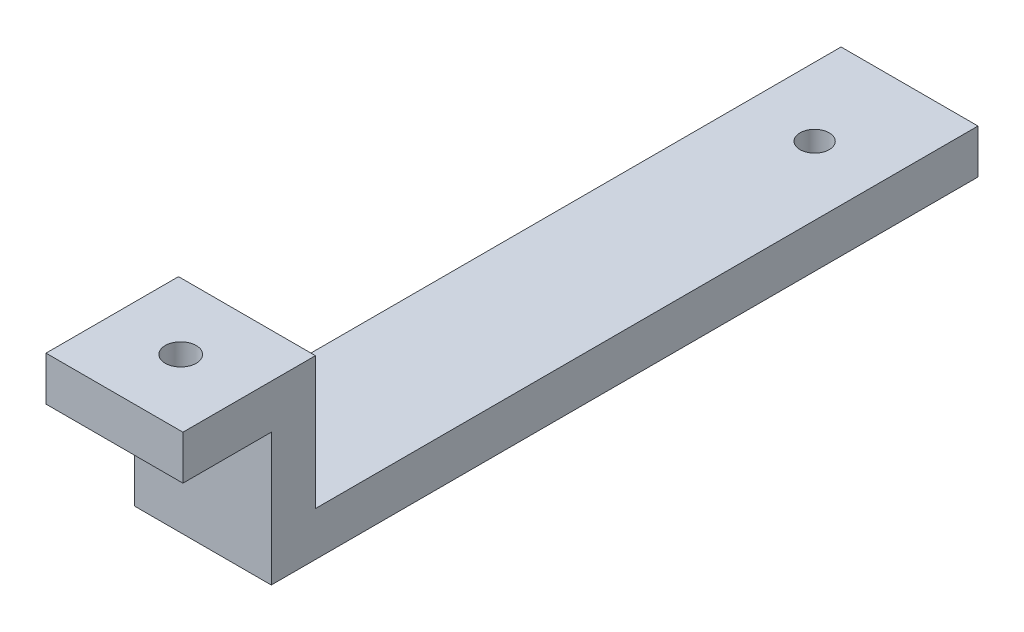
ISO-10303-21;
HEADER;
FILE_DESCRIPTION(('STEP AP214'),'2;1');
FILE_NAME('part.step','',(''),(''),'','','');
FILE_SCHEMA(('AUTOMOTIVE_DESIGN { 1 0 10303 214 1 1 1 1 }'));
ENDSEC;
DATA;
#1=APPLICATION_CONTEXT('core data for automotive mechanical design processes');
#2=APPLICATION_PROTOCOL_DEFINITION('international standard','automotive_design',2000,#1);
#3=PRODUCT_CONTEXT('',#1,'mechanical');
#4=PRODUCT('Part','Part','',(#3));
#5=PRODUCT_RELATED_PRODUCT_CATEGORY('part','',(#4));
#6=PRODUCT_DEFINITION_FORMATION('','',#4);
#7=PRODUCT_DEFINITION_CONTEXT('part definition',#1,'design');
#8=PRODUCT_DEFINITION('design','',#6,#7);
#9=PRODUCT_DEFINITION_SHAPE('','',#8);
#10=(LENGTH_UNIT() NAMED_UNIT(*) SI_UNIT(.MILLI.,.METRE.));
#11=(NAMED_UNIT(*) PLANE_ANGLE_UNIT() SI_UNIT($,.RADIAN.));
#12=(NAMED_UNIT(*) SI_UNIT($,.STERADIAN.) SOLID_ANGLE_UNIT());
#13=UNCERTAINTY_MEASURE_WITH_UNIT(LENGTH_MEASURE(1.E-05),#10,'distance_accuracy_value','');
#14=(GEOMETRIC_REPRESENTATION_CONTEXT(3) GLOBAL_UNCERTAINTY_ASSIGNED_CONTEXT((#13)) GLOBAL_UNIT_ASSIGNED_CONTEXT((#10,
#11,#12)) REPRESENTATION_CONTEXT('',''));
#15=CARTESIAN_POINT('',(0.,0.,0.));
#16=DIRECTION('',(0.,0.,1.));
#17=DIRECTION('',(1.,0.,0.));
#18=AXIS2_PLACEMENT_3D('',#15,#16,#17);
#19=CARTESIAN_POINT('',(31.,-39.972,-30.));
#20=DIRECTION('',(0.,1.,0.));
#21=DIRECTION('',(0.,0.,1.));
#22=AXIS2_PLACEMENT_3D('',#19,#20,#21);
#23=PLANE('',#22);
#24=CARTESIAN_POINT('',(15.494,-39.972,-158.524));
#25=DIRECTION('',(0.,1.,0.));
#26=DIRECTION('',(0.,0.,1.));
#27=AXIS2_PLACEMENT_3D('',#24,#25,#26);
#28=CIRCLE('',#27,3.30199999999998);
#29=CARTESIAN_POINT('',(15.494,-39.972,-155.222));
#30=VERTEX_POINT('',#29);
#31=EDGE_CURVE('E182',#30,#30,#28,.T.);
#32=ORIENTED_EDGE('',*,*,#31,.T.);
#33=EDGE_LOOP('',(#32));
#34=FACE_BOUND('',#33,.T.);
#35=DIRECTION('',(0.,0.,-1.));
#36=VECTOR('',#35,1.);
#37=CARTESIAN_POINT('',(0.,-39.972,-30.));
#38=LINE('',#37,#36);
#39=CARTESIAN_POINT('',(0.,-39.972,-20.));
#40=VERTEX_POINT('',#39);
#41=CARTESIAN_POINT('',(0.,-39.972,-180.));
#42=VERTEX_POINT('',#41);
#43=EDGE_CURVE('E131',#40,#42,#38,.T.);
#44=ORIENTED_EDGE('',*,*,#43,.T.);
#45=DIRECTION('',(-1.,0.,0.));
#46=VECTOR('',#45,1.);
#47=CARTESIAN_POINT('',(31.,-39.972,-180.));
#48=LINE('',#47,#46);
#49=CARTESIAN_POINT('',(31.,-39.972,-180.));
#50=VERTEX_POINT('',#49);
#51=EDGE_CURVE('E11',#50,#42,#48,.T.);
#52=ORIENTED_EDGE('',*,*,#51,.F.);
#53=DIRECTION('',(0.,0.,-1.));
#54=VECTOR('',#53,1.);
#55=CARTESIAN_POINT('',(31.,-39.972,-30.));
#56=LINE('',#55,#54);
#57=CARTESIAN_POINT('',(31.,-39.972,-20.));
#58=VERTEX_POINT('',#57);
#59=EDGE_CURVE('E89',#58,#50,#56,.T.);
#60=ORIENTED_EDGE('',*,*,#59,.F.);
#61=DIRECTION('',(-1.,0.,0.));
#62=VECTOR('',#61,1.);
#63=CARTESIAN_POINT('',(31.,-39.972,-20.));
#64=LINE('',#63,#62);
#65=EDGE_CURVE('E130',#58,#40,#64,.T.);
#66=ORIENTED_EDGE('',*,*,#65,.T.);
#67=EDGE_LOOP('',(#44,#52,#60,#66));
#68=FACE_BOUND('',#67,.T.);
#69=ADVANCED_FACE('F34',(#34,#68),#23,.F.);
#70=CARTESIAN_POINT('',(31.,-29.972,-180.));
#71=DIRECTION('',(0.,0.,-1.));
#72=DIRECTION('',(-1.,0.,0.));
#73=AXIS2_PLACEMENT_3D('',#70,#71,#72);
#74=PLANE('',#73);
#75=DIRECTION('',(0.,-1.,0.));
#76=VECTOR('',#75,1.);
#77=CARTESIAN_POINT('',(0.,-29.972,-180.));
#78=LINE('',#77,#76);
#79=CARTESIAN_POINT('',(0.,-29.972,-180.));
#80=VERTEX_POINT('',#79);
#81=EDGE_CURVE('E134',#80,#42,#78,.T.);
#82=ORIENTED_EDGE('',*,*,#81,.F.);
#83=DIRECTION('',(-1.,0.,0.));
#84=VECTOR('',#83,1.);
#85=CARTESIAN_POINT('',(31.,-29.972,-180.));
#86=LINE('',#85,#84);
#87=CARTESIAN_POINT('',(31.,-29.972,-180.));
#88=VERTEX_POINT('',#87);
#89=EDGE_CURVE('E42',#88,#80,#86,.T.);
#90=ORIENTED_EDGE('',*,*,#89,.F.);
#91=DIRECTION('',(0.,-1.,0.));
#92=VECTOR('',#91,1.);
#93=CARTESIAN_POINT('',(31.,-29.972,-180.));
#94=LINE('',#93,#92);
#95=EDGE_CURVE('E174',#88,#50,#94,.T.);
#96=ORIENTED_EDGE('',*,*,#95,.T.);
#97=ORIENTED_EDGE('',*,*,#51,.T.);
#98=EDGE_LOOP('',(#82,#90,#96,#97));
#99=FACE_BOUND('',#98,.T.);
#100=ADVANCED_FACE('F165',(#99),#74,.T.);
#101=CARTESIAN_POINT('',(31.,-29.972,-30.));
#102=DIRECTION('',(0.,1.,0.));
#103=DIRECTION('',(0.,0.,1.));
#104=AXIS2_PLACEMENT_3D('',#101,#102,#103);
#105=PLANE('',#104);
#106=CARTESIAN_POINT('',(15.494,-29.972,-158.524));
#107=DIRECTION('',(0.,1.,0.));
#108=DIRECTION('',(0.,0.,1.));
#109=AXIS2_PLACEMENT_3D('',#106,#107,#108);
#110=CIRCLE('',#109,3.30199999999998);
#111=CARTESIAN_POINT('',(15.494,-29.972,-155.222));
#112=VERTEX_POINT('',#111);
#113=EDGE_CURVE('E187',#112,#112,#110,.T.);
#114=ORIENTED_EDGE('',*,*,#113,.F.);
#115=EDGE_LOOP('',(#114));
#116=FACE_BOUND('',#115,.T.);
#117=DIRECTION('',(0.,0.,-1.));
#118=VECTOR('',#117,1.);
#119=CARTESIAN_POINT('',(0.,-29.972,-30.));
#120=LINE('',#119,#118);
#121=CARTESIAN_POINT('',(0.,-29.972,-30.));
#122=VERTEX_POINT('',#121);
#123=EDGE_CURVE('E138',#122,#80,#120,.T.);
#124=ORIENTED_EDGE('',*,*,#123,.F.);
#125=DIRECTION('',(-1.,0.,0.));
#126=VECTOR('',#125,1.);
#127=CARTESIAN_POINT('',(31.,-29.972,-30.));
#128=LINE('',#127,#126);
#129=CARTESIAN_POINT('',(31.,-29.972,-30.));
#130=VERTEX_POINT('',#129);
#131=EDGE_CURVE('E155',#130,#122,#128,.T.);
#132=ORIENTED_EDGE('',*,*,#131,.F.);
#133=DIRECTION('',(0.,0.,-1.));
#134=VECTOR('',#133,1.);
#135=CARTESIAN_POINT('',(31.,-29.972,-30.));
#136=LINE('',#135,#134);
#137=EDGE_CURVE('E162',#130,#88,#136,.T.);
#138=ORIENTED_EDGE('',*,*,#137,.T.);
#139=ORIENTED_EDGE('',*,*,#89,.T.);
#140=EDGE_LOOP('',(#124,#132,#138,#139));
#141=FACE_BOUND('',#140,.T.);
#142=ADVANCED_FACE('F160',(#116,#141),#105,.T.);
#143=CARTESIAN_POINT('',(31.,0.,-30.));
#144=DIRECTION('',(0.,0.,-1.));
#145=DIRECTION('',(-1.,0.,0.));
#146=AXIS2_PLACEMENT_3D('',#143,#144,#145);
#147=PLANE('',#146);
#148=DIRECTION('',(0.,-1.,0.));
#149=VECTOR('',#148,1.);
#150=CARTESIAN_POINT('',(0.,0.,-30.));
#151=LINE('',#150,#149);
#152=CARTESIAN_POINT('',(0.,0.,-30.));
#153=VERTEX_POINT('',#152);
#154=EDGE_CURVE('E141',#153,#122,#151,.T.);
#155=ORIENTED_EDGE('',*,*,#154,.F.);
#156=DIRECTION('',(-1.,0.,0.));
#157=VECTOR('',#156,1.);
#158=CARTESIAN_POINT('',(31.,0.,-30.));
#159=LINE('',#158,#157);
#160=CARTESIAN_POINT('',(31.,0.,-30.));
#161=VERTEX_POINT('',#160);
#162=EDGE_CURVE('E153',#161,#153,#159,.T.);
#163=ORIENTED_EDGE('',*,*,#162,.F.);
#164=DIRECTION('',(0.,-1.,0.));
#165=VECTOR('',#164,1.);
#166=CARTESIAN_POINT('',(31.,0.,-30.));
#167=LINE('',#166,#165);
#168=EDGE_CURVE('E125',#161,#130,#167,.T.);
#169=ORIENTED_EDGE('',*,*,#168,.T.);
#170=ORIENTED_EDGE('',*,*,#131,.T.);
#171=EDGE_LOOP('',(#155,#163,#169,#170));
#172=FACE_BOUND('',#171,.T.);
#173=ADVANCED_FACE('F172',(#172),#147,.T.);
#174=CARTESIAN_POINT('',(31.,0.,0.));
#175=DIRECTION('',(0.,1.,0.));
#176=DIRECTION('',(0.,0.,1.));
#177=AXIS2_PLACEMENT_3D('',#174,#175,#176);
#178=PLANE('',#177);
#179=CARTESIAN_POINT('',(15.5,0.,-15.));
#180=DIRECTION('',(0.,1.,0.));
#181=DIRECTION('',(0.,0.,1.));
#182=AXIS2_PLACEMENT_3D('',#179,#180,#181);
#183=CIRCLE('',#182,3.5);
#184=CARTESIAN_POINT('',(15.5,0.,-11.5));
#185=VERTEX_POINT('',#184);
#186=EDGE_CURVE('E179',#185,#185,#183,.T.);
#187=ORIENTED_EDGE('',*,*,#186,.F.);
#188=EDGE_LOOP('',(#187));
#189=FACE_BOUND('',#188,.T.);
#190=DIRECTION('',(0.,0.,-1.));
#191=VECTOR('',#190,1.);
#192=CARTESIAN_POINT('',(0.,0.,0.));
#193=LINE('',#192,#191);
#194=CARTESIAN_POINT('',(0.,0.,0.));
#195=VERTEX_POINT('',#194);
#196=EDGE_CURVE('E144',#195,#153,#193,.T.);
#197=ORIENTED_EDGE('',*,*,#196,.F.);
#198=DIRECTION('',(-1.,0.,0.));
#199=VECTOR('',#198,1.);
#200=CARTESIAN_POINT('',(31.,0.,0.));
#201=LINE('',#200,#199);
#202=CARTESIAN_POINT('',(31.,0.,0.));
#203=VERTEX_POINT('',#202);
#204=EDGE_CURVE('E113',#203,#195,#201,.T.);
#205=ORIENTED_EDGE('',*,*,#204,.F.);
#206=DIRECTION('',(0.,0.,-1.));
#207=VECTOR('',#206,1.);
#208=CARTESIAN_POINT('',(31.,0.,0.));
#209=LINE('',#208,#207);
#210=EDGE_CURVE('E123',#203,#161,#209,.T.);
#211=ORIENTED_EDGE('',*,*,#210,.T.);
#212=ORIENTED_EDGE('',*,*,#162,.T.);
#213=EDGE_LOOP('',(#197,#205,#211,#212));
#214=FACE_BOUND('',#213,.T.);
#215=ADVANCED_FACE('F200',(#189,#214),#178,.T.);
#216=CARTESIAN_POINT('',(31.,-10.,0.));
#217=DIRECTION('',(0.,0.,1.));
#218=DIRECTION('',(1.,0.,0.));
#219=AXIS2_PLACEMENT_3D('',#216,#217,#218);
#220=PLANE('',#219);
#221=DIRECTION('',(0.,1.,0.));
#222=VECTOR('',#221,1.);
#223=CARTESIAN_POINT('',(0.,-10.,0.));
#224=LINE('',#223,#222);
#225=CARTESIAN_POINT('',(0.,-10.,0.));
#226=VERTEX_POINT('',#225);
#227=EDGE_CURVE('E112',#226,#195,#224,.T.);
#228=ORIENTED_EDGE('',*,*,#227,.F.);
#229=DIRECTION('',(-1.,0.,0.));
#230=VECTOR('',#229,1.);
#231=CARTESIAN_POINT('',(31.,-10.,0.));
#232=LINE('',#231,#230);
#233=CARTESIAN_POINT('',(31.,-10.,0.));
#234=VERTEX_POINT('',#233);
#235=EDGE_CURVE('E106',#234,#226,#232,.T.);
#236=ORIENTED_EDGE('',*,*,#235,.F.);
#237=DIRECTION('',(0.,1.,0.));
#238=VECTOR('',#237,1.);
#239=CARTESIAN_POINT('',(31.,-10.,0.));
#240=LINE('',#239,#238);
#241=EDGE_CURVE('E110',#234,#203,#240,.T.);
#242=ORIENTED_EDGE('',*,*,#241,.T.);
#243=ORIENTED_EDGE('',*,*,#204,.T.);
#244=EDGE_LOOP('',(#228,#236,#242,#243));
#245=FACE_BOUND('',#244,.T.);
#246=ADVANCED_FACE('F108',(#245),#220,.T.);
#247=CARTESIAN_POINT('',(31.,-10.,0.));
#248=DIRECTION('',(0.,1.,0.));
#249=DIRECTION('',(0.,0.,1.));
#250=AXIS2_PLACEMENT_3D('',#247,#248,#249);
#251=PLANE('',#250);
#252=CARTESIAN_POINT('',(15.5,-10.,-15.));
#253=DIRECTION('',(0.,1.,0.));
#254=DIRECTION('',(0.,0.,1.));
#255=AXIS2_PLACEMENT_3D('',#252,#253,#254);
#256=CIRCLE('',#255,3.5);
#257=CARTESIAN_POINT('',(15.5,-10.,-11.5));
#258=VERTEX_POINT('',#257);
#259=EDGE_CURVE('E135',#258,#258,#256,.T.);
#260=ORIENTED_EDGE('',*,*,#259,.T.);
#261=EDGE_LOOP('',(#260));
#262=FACE_BOUND('',#261,.T.);
#263=DIRECTION('',(0.,0.,-1.));
#264=VECTOR('',#263,1.);
#265=CARTESIAN_POINT('',(0.,-10.,0.));
#266=LINE('',#265,#264);
#267=CARTESIAN_POINT('',(0.,-10.,-20.));
#268=VERTEX_POINT('',#267);
#269=EDGE_CURVE('E77',#226,#268,#266,.T.);
#270=ORIENTED_EDGE('',*,*,#269,.T.);
#271=DIRECTION('',(-1.,0.,0.));
#272=VECTOR('',#271,1.);
#273=CARTESIAN_POINT('',(31.,-10.,-20.));
#274=LINE('',#273,#272);
#275=CARTESIAN_POINT('',(31.,-10.,-20.));
#276=VERTEX_POINT('',#275);
#277=EDGE_CURVE('E114',#276,#268,#274,.T.);
#278=ORIENTED_EDGE('',*,*,#277,.F.);
#279=DIRECTION('',(0.,0.,-1.));
#280=VECTOR('',#279,1.);
#281=CARTESIAN_POINT('',(31.,-10.,0.));
#282=LINE('',#281,#280);
#283=EDGE_CURVE('E116',#234,#276,#282,.T.);
#284=ORIENTED_EDGE('',*,*,#283,.F.);
#285=ORIENTED_EDGE('',*,*,#235,.T.);
#286=EDGE_LOOP('',(#270,#278,#284,#285));
#287=FACE_BOUND('',#286,.T.);
#288=ADVANCED_FACE('F117',(#262,#287),#251,.F.);
#289=CARTESIAN_POINT('',(31.,0.,-20.));
#290=DIRECTION('',(0.,0.,-1.));
#291=DIRECTION('',(-1.,0.,0.));
#292=AXIS2_PLACEMENT_3D('',#289,#290,#291);
#293=PLANE('',#292);
#294=DIRECTION('',(0.,1.,0.));
#295=VECTOR('',#294,1.);
#296=CARTESIAN_POINT('',(0.,0.,-20.));
#297=LINE('',#296,#295);
#298=EDGE_CURVE('E83',#268,#40,#297,.F.);
#299=ORIENTED_EDGE('',*,*,#298,.T.);
#300=ORIENTED_EDGE('',*,*,#65,.F.);
#301=DIRECTION('',(0.,1.,0.));
#302=VECTOR('',#301,1.);
#303=CARTESIAN_POINT('',(31.,0.,-20.));
#304=LINE('',#303,#302);
#305=EDGE_CURVE('E50',#276,#58,#304,.F.);
#306=ORIENTED_EDGE('',*,*,#305,.F.);
#307=ORIENTED_EDGE('',*,*,#277,.T.);
#308=EDGE_LOOP('',(#299,#300,#306,#307));
#309=FACE_BOUND('',#308,.T.);
#310=ADVANCED_FACE('F208',(#309),#293,.F.);
#311=CARTESIAN_POINT('',(31.,0.,0.));
#312=DIRECTION('',(-1.,0.,0.));
#313=DIRECTION('',(0.,0.,1.));
#314=AXIS2_PLACEMENT_3D('',#311,#312,#313);
#315=PLANE('',#314);
#316=ORIENTED_EDGE('',*,*,#59,.T.);
#317=ORIENTED_EDGE('',*,*,#95,.F.);
#318=ORIENTED_EDGE('',*,*,#137,.F.);
#319=ORIENTED_EDGE('',*,*,#168,.F.);
#320=ORIENTED_EDGE('',*,*,#210,.F.);
#321=ORIENTED_EDGE('',*,*,#241,.F.);
#322=ORIENTED_EDGE('',*,*,#283,.T.);
#323=ORIENTED_EDGE('',*,*,#305,.T.);
#324=EDGE_LOOP('',(#316,#317,#318,#319,#320,#321,#322,#323));
#325=FACE_BOUND('',#324,.T.);
#326=ADVANCED_FACE('F120',(#325),#315,.F.);
#327=CARTESIAN_POINT('',(0.,0.,0.));
#328=DIRECTION('',(-1.,0.,0.));
#329=DIRECTION('',(0.,0.,1.));
#330=AXIS2_PLACEMENT_3D('',#327,#328,#329);
#331=PLANE('',#330);
#332=ORIENTED_EDGE('',*,*,#43,.F.);
#333=ORIENTED_EDGE('',*,*,#298,.F.);
#334=ORIENTED_EDGE('',*,*,#269,.F.);
#335=ORIENTED_EDGE('',*,*,#227,.T.);
#336=ORIENTED_EDGE('',*,*,#196,.T.);
#337=ORIENTED_EDGE('',*,*,#154,.T.);
#338=ORIENTED_EDGE('',*,*,#123,.T.);
#339=ORIENTED_EDGE('',*,*,#81,.T.);
#340=EDGE_LOOP('',(#332,#333,#334,#335,#336,#337,#338,#339));
#341=FACE_BOUND('',#340,.T.);
#342=ADVANCED_FACE('F168',(#341),#331,.T.);
#343=CARTESIAN_POINT('',(15.5,-10.,-15.));
#344=DIRECTION('',(0.,1.,0.));
#345=DIRECTION('',(0.,0.,1.));
#346=AXIS2_PLACEMENT_3D('',#343,#344,#345);
#347=CYLINDRICAL_SURFACE('',#346,3.5);
#348=ORIENTED_EDGE('',*,*,#259,.F.);
#349=EDGE_LOOP('',(#348));
#350=FACE_BOUND('',#349,.T.);
#351=ORIENTED_EDGE('',*,*,#186,.T.);
#352=EDGE_LOOP('',(#351));
#353=FACE_BOUND('',#352,.T.);
#354=ADVANCED_FACE('F229',(#350,#353),#347,.F.);
#355=CARTESIAN_POINT('',(15.494,-40.132,-158.524));
#356=DIRECTION('',(0.,1.,0.));
#357=DIRECTION('',(0.,0.,1.));
#358=AXIS2_PLACEMENT_3D('',#355,#356,#357);
#359=CYLINDRICAL_SURFACE('',#358,3.30199999999998);
#360=ORIENTED_EDGE('',*,*,#113,.T.);
#361=EDGE_LOOP('',(#360));
#362=FACE_BOUND('',#361,.T.);
#363=ORIENTED_EDGE('',*,*,#31,.F.);
#364=EDGE_LOOP('',(#363));
#365=FACE_BOUND('',#364,.T.);
#366=ADVANCED_FACE('F191',(#362,#365),#359,.F.);
#367=CLOSED_SHELL('',(#69,#100,#142,#173,#215,#246,#288,#310,#326,#342,#354,#366));
#368=MANIFOLD_SOLID_BREP('B2',#367);
#369=ADVANCED_BREP_SHAPE_REPRESENTATION('',(#18,#368),#14);
#370=SHAPE_DEFINITION_REPRESENTATION(#9,#369);
ENDSEC;
END-ISO-10303-21;
